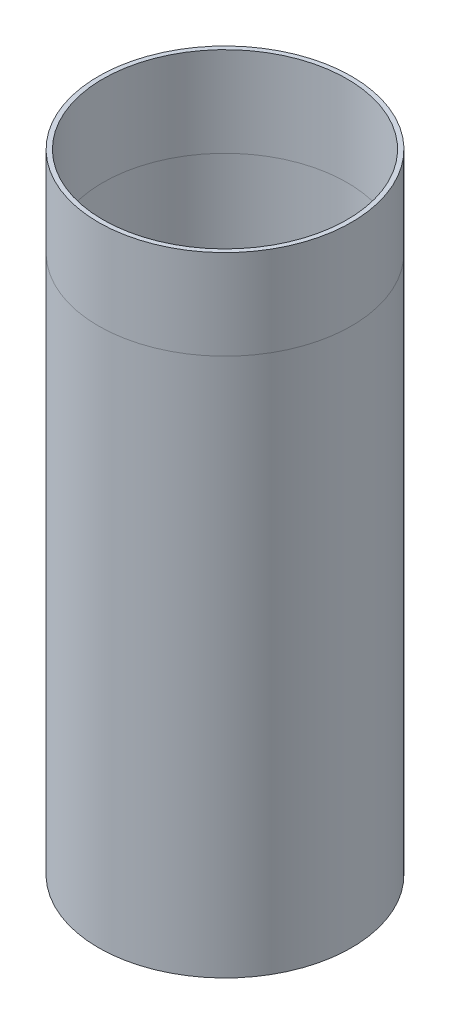
ISO-10303-21;
HEADER;
FILE_DESCRIPTION(('STEP AP214'),'2;1');
FILE_NAME('part.step','',(''),(''),'','','');
FILE_SCHEMA(('AUTOMOTIVE_DESIGN { 1 0 10303 214 1 1 1 1 }'));
ENDSEC;
DATA;
#1=APPLICATION_CONTEXT('core data for automotive mechanical design processes');
#2=APPLICATION_PROTOCOL_DEFINITION('international standard','automotive_design',2000,#1);
#3=PRODUCT_CONTEXT('',#1,'mechanical');
#4=PRODUCT('Part','Part','',(#3));
#5=PRODUCT_RELATED_PRODUCT_CATEGORY('part','',(#4));
#6=PRODUCT_DEFINITION_FORMATION('','',#4);
#7=PRODUCT_DEFINITION_CONTEXT('part definition',#1,'design');
#8=PRODUCT_DEFINITION('design','',#6,#7);
#9=PRODUCT_DEFINITION_SHAPE('','',#8);
#10=(LENGTH_UNIT() NAMED_UNIT(*) SI_UNIT(.MILLI.,.METRE.));
#11=(NAMED_UNIT(*) PLANE_ANGLE_UNIT() SI_UNIT($,.RADIAN.));
#12=(NAMED_UNIT(*) SI_UNIT($,.STERADIAN.) SOLID_ANGLE_UNIT());
#13=UNCERTAINTY_MEASURE_WITH_UNIT(LENGTH_MEASURE(1.E-05),#10,'distance_accuracy_value','');
#14=(GEOMETRIC_REPRESENTATION_CONTEXT(3) GLOBAL_UNCERTAINTY_ASSIGNED_CONTEXT((#13)) GLOBAL_UNIT_ASSIGNED_CONTEXT((#10,
#11,#12)) REPRESENTATION_CONTEXT('',''));
#15=CARTESIAN_POINT('',(0.,0.,0.));
#16=DIRECTION('',(0.,0.,1.));
#17=DIRECTION('',(1.,0.,0.));
#18=AXIS2_PLACEMENT_3D('',#15,#16,#17);
#19=CARTESIAN_POINT('',(0.,125.,0.));
#20=DIRECTION('',(0.,1.,0.));
#21=DIRECTION('',(0.,0.,1.));
#22=AXIS2_PLACEMENT_3D('',#19,#20,#21);
#23=PLANE('',#22);
#24=CARTESIAN_POINT('',(0.,125.,0.));
#25=DIRECTION('',(0.,1.,0.));
#26=DIRECTION('',(0.,0.,1.));
#27=AXIS2_PLACEMENT_3D('',#24,#25,#26);
#28=CIRCLE('',#27,70.5);
#29=CARTESIAN_POINT('',(0.,125.,70.5));
#30=VERTEX_POINT('',#29);
#31=EDGE_CURVE('E56',#30,#30,#28,.T.);
#32=ORIENTED_EDGE('',*,*,#31,.T.);
#33=EDGE_LOOP('',(#32));
#34=FACE_BOUND('',#33,.T.);
#35=CARTESIAN_POINT('',(0.,125.,0.));
#36=DIRECTION('',(0.,1.,0.));
#37=DIRECTION('',(0.,0.,1.));
#38=AXIS2_PLACEMENT_3D('',#35,#36,#37);
#39=CIRCLE('',#38,68.);
#40=CARTESIAN_POINT('',(0.,125.,68.));
#41=VERTEX_POINT('',#40);
#42=EDGE_CURVE('E65',#41,#41,#39,.T.);
#43=ORIENTED_EDGE('',*,*,#42,.F.);
#44=EDGE_LOOP('',(#43));
#45=FACE_BOUND('',#44,.T.);
#46=ADVANCED_FACE('F52',(#34,#45),#23,.T.);
#47=CARTESIAN_POINT('',(0.,-175.,0.));
#48=DIRECTION('',(0.,1.,0.));
#49=DIRECTION('',(0.,0.,1.));
#50=AXIS2_PLACEMENT_3D('',#47,#48,#49);
#51=PLANE('',#50);
#52=CARTESIAN_POINT('',(0.,-175.,0.));
#53=DIRECTION('',(0.,1.,0.));
#54=DIRECTION('',(0.,0.,1.));
#55=AXIS2_PLACEMENT_3D('',#52,#53,#54);
#56=CIRCLE('',#55,70.5);
#57=CARTESIAN_POINT('',(0.,-175.,70.5));
#58=VERTEX_POINT('',#57);
#59=EDGE_CURVE('E60',#58,#58,#56,.T.);
#60=ORIENTED_EDGE('',*,*,#59,.F.);
#61=EDGE_LOOP('',(#60));
#62=FACE_BOUND('',#61,.T.);
#63=CARTESIAN_POINT('',(0.,-175.,0.));
#64=DIRECTION('',(0.,1.,0.));
#65=DIRECTION('',(0.,0.,1.));
#66=AXIS2_PLACEMENT_3D('',#63,#64,#65);
#67=CIRCLE('',#66,68.);
#68=CARTESIAN_POINT('',(0.,-175.,68.));
#69=VERTEX_POINT('',#68);
#70=EDGE_CURVE('E11',#69,#69,#67,.T.);
#71=ORIENTED_EDGE('',*,*,#70,.T.);
#72=EDGE_LOOP('',(#71));
#73=FACE_BOUND('',#72,.T.);
#74=ADVANCED_FACE('F85',(#62,#73),#51,.F.);
#75=CARTESIAN_POINT('',(0.,175.,0.));
#76=DIRECTION('',(0.,-1.,0.));
#77=DIRECTION('',(0.,0.,-1.));
#78=AXIS2_PLACEMENT_3D('',#75,#76,#77);
#79=CYLINDRICAL_SURFACE('',#78,68.);
#80=ORIENTED_EDGE('',*,*,#70,.F.);
#81=EDGE_LOOP('',(#80));
#82=FACE_BOUND('',#81,.T.);
#83=ORIENTED_EDGE('',*,*,#42,.T.);
#84=EDGE_LOOP('',(#83));
#85=FACE_BOUND('',#84,.T.);
#86=ADVANCED_FACE('F54',(#82,#85),#79,.F.);
#87=CARTESIAN_POINT('',(0.,175.,0.));
#88=DIRECTION('',(0.,-1.,0.));
#89=DIRECTION('',(0.,0.,-1.));
#90=AXIS2_PLACEMENT_3D('',#87,#88,#89);
#91=CYLINDRICAL_SURFACE('',#90,70.5);
#92=ORIENTED_EDGE('',*,*,#59,.T.);
#93=EDGE_LOOP('',(#92));
#94=FACE_BOUND('',#93,.T.);
#95=ORIENTED_EDGE('',*,*,#31,.F.);
#96=EDGE_LOOP('',(#95));
#97=FACE_BOUND('',#96,.T.);
#98=ADVANCED_FACE('F79',(#94,#97),#91,.T.);
#99=CLOSED_SHELL('',(#46,#74,#86,#98));
#100=MANIFOLD_SOLID_BREP('B2',#99);
#101=CARTESIAN_POINT('',(0.,125.,0.));
#102=DIRECTION('',(0.,1.,0.));
#103=DIRECTION('',(0.,0.,1.));
#104=AXIS2_PLACEMENT_3D('',#101,#102,#103);
#105=PLANE('',#104);
#106=CARTESIAN_POINT('',(0.,125.,0.));
#107=DIRECTION('',(0.,1.,0.));
#108=DIRECTION('',(0.,0.,1.));
#109=AXIS2_PLACEMENT_3D('',#106,#107,#108);
#110=CIRCLE('',#109,68.);
#111=CARTESIAN_POINT('',(0.,125.,68.));
#112=VERTEX_POINT('',#111);
#113=EDGE_CURVE('E51',#112,#112,#110,.T.);
#114=ORIENTED_EDGE('',*,*,#113,.T.);
#115=EDGE_LOOP('',(#114));
#116=FACE_BOUND('',#115,.T.);
#117=CARTESIAN_POINT('',(0.,125.,0.));
#118=DIRECTION('',(0.,1.,0.));
#119=DIRECTION('',(0.,0.,1.));
#120=AXIS2_PLACEMENT_3D('',#117,#118,#119);
#121=CIRCLE('',#120,70.5);
#122=CARTESIAN_POINT('',(0.,125.,70.5));
#123=VERTEX_POINT('',#122);
#124=EDGE_CURVE('E136',#123,#123,#121,.T.);
#125=ORIENTED_EDGE('',*,*,#124,.F.);
#126=EDGE_LOOP('',(#125));
#127=FACE_BOUND('',#126,.T.);
#128=ADVANCED_FACE('F133',(#116,#127),#105,.F.);
#129=CARTESIAN_POINT('',(0.,175.,0.));
#130=DIRECTION('',(0.,1.,0.));
#131=DIRECTION('',(0.,0.,1.));
#132=AXIS2_PLACEMENT_3D('',#129,#130,#131);
#133=PLANE('',#132);
#134=CARTESIAN_POINT('',(0.,175.,0.));
#135=DIRECTION('',(0.,1.,0.));
#136=DIRECTION('',(0.,0.,1.));
#137=AXIS2_PLACEMENT_3D('',#134,#135,#136);
#138=CIRCLE('',#137,70.5);
#139=CARTESIAN_POINT('',(0.,175.,70.5));
#140=VERTEX_POINT('',#139);
#141=EDGE_CURVE('E146',#140,#140,#138,.T.);
#142=ORIENTED_EDGE('',*,*,#141,.T.);
#143=EDGE_LOOP('',(#142));
#144=FACE_BOUND('',#143,.T.);
#145=CARTESIAN_POINT('',(0.,175.,0.));
#146=DIRECTION('',(0.,1.,0.));
#147=DIRECTION('',(0.,0.,1.));
#148=AXIS2_PLACEMENT_3D('',#145,#146,#147);
#149=CIRCLE('',#148,68.);
#150=CARTESIAN_POINT('',(0.,175.,68.));
#151=VERTEX_POINT('',#150);
#152=EDGE_CURVE('E151',#151,#151,#149,.T.);
#153=ORIENTED_EDGE('',*,*,#152,.F.);
#154=EDGE_LOOP('',(#153));
#155=FACE_BOUND('',#154,.T.);
#156=ADVANCED_FACE('F157',(#144,#155),#133,.T.);
#157=CARTESIAN_POINT('',(0.,175.,0.));
#158=DIRECTION('',(0.,-1.,0.));
#159=DIRECTION('',(0.,0.,-1.));
#160=AXIS2_PLACEMENT_3D('',#157,#158,#159);
#161=CYLINDRICAL_SURFACE('',#160,70.5);
#162=ORIENTED_EDGE('',*,*,#124,.T.);
#163=EDGE_LOOP('',(#162));
#164=FACE_BOUND('',#163,.T.);
#165=ORIENTED_EDGE('',*,*,#141,.F.);
#166=EDGE_LOOP('',(#165));
#167=FACE_BOUND('',#166,.T.);
#168=ADVANCED_FACE('F159',(#164,#167),#161,.T.);
#169=CARTESIAN_POINT('',(0.,175.,0.));
#170=DIRECTION('',(0.,-1.,0.));
#171=DIRECTION('',(0.,0.,-1.));
#172=AXIS2_PLACEMENT_3D('',#169,#170,#171);
#173=CYLINDRICAL_SURFACE('',#172,68.);
#174=ORIENTED_EDGE('',*,*,#113,.F.);
#175=EDGE_LOOP('',(#174));
#176=FACE_BOUND('',#175,.T.);
#177=ORIENTED_EDGE('',*,*,#152,.T.);
#178=EDGE_LOOP('',(#177));
#179=FACE_BOUND('',#178,.T.);
#180=ADVANCED_FACE('F155',(#176,#179),#173,.F.);
#181=CLOSED_SHELL('',(#128,#156,#168,#180));
#182=MANIFOLD_SOLID_BREP('B6',#181);
#183=ADVANCED_BREP_SHAPE_REPRESENTATION('',(#18,#100,#182),#14);
#184=SHAPE_DEFINITION_REPRESENTATION(#9,#183);
ENDSEC;
END-ISO-10303-21;
